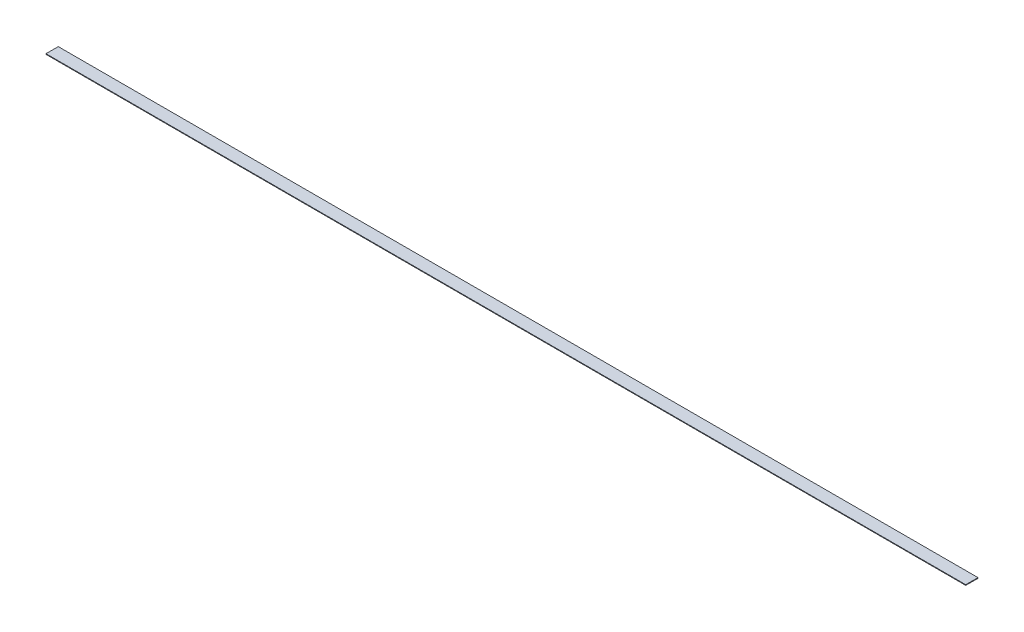
ISO-10303-21;
HEADER;
FILE_DESCRIPTION(('STEP AP214'),'2;1');
FILE_NAME('part.step','',(''),(''),'','','');
FILE_SCHEMA(('AUTOMOTIVE_DESIGN { 1 0 10303 214 1 1 1 1 }'));
ENDSEC;
DATA;
#1=APPLICATION_CONTEXT('core data for automotive mechanical design processes');
#2=APPLICATION_PROTOCOL_DEFINITION('international standard','automotive_design',2000,#1);
#3=PRODUCT_CONTEXT('',#1,'mechanical');
#4=PRODUCT('Part','Part','',(#3));
#5=PRODUCT_RELATED_PRODUCT_CATEGORY('part','',(#4));
#6=PRODUCT_DEFINITION_FORMATION('','',#4);
#7=PRODUCT_DEFINITION_CONTEXT('part definition',#1,'design');
#8=PRODUCT_DEFINITION('design','',#6,#7);
#9=PRODUCT_DEFINITION_SHAPE('','',#8);
#10=(LENGTH_UNIT() NAMED_UNIT(*) SI_UNIT(.MILLI.,.METRE.));
#11=(NAMED_UNIT(*) PLANE_ANGLE_UNIT() SI_UNIT($,.RADIAN.));
#12=(NAMED_UNIT(*) SI_UNIT($,.STERADIAN.) SOLID_ANGLE_UNIT());
#13=UNCERTAINTY_MEASURE_WITH_UNIT(LENGTH_MEASURE(1.E-05),#10,'distance_accuracy_value','');
#14=(GEOMETRIC_REPRESENTATION_CONTEXT(3) GLOBAL_UNCERTAINTY_ASSIGNED_CONTEXT((#13)) GLOBAL_UNIT_ASSIGNED_CONTEXT((#10,
#11,#12)) REPRESENTATION_CONTEXT('',''));
#15=CARTESIAN_POINT('',(0.,0.,0.));
#16=DIRECTION('',(0.,0.,1.));
#17=DIRECTION('',(1.,0.,0.));
#18=AXIS2_PLACEMENT_3D('',#15,#16,#17);
#19=CARTESIAN_POINT('',(1500.,2.,-20.0000000000002));
#20=DIRECTION('',(-1.,0.,0.));
#21=DIRECTION('',(0.,0.,1.));
#22=AXIS2_PLACEMENT_3D('',#19,#20,#21);
#23=PLANE('',#22);
#24=DIRECTION('',(0.,0.,-1.));
#25=VECTOR('',#24,1.);
#26=CARTESIAN_POINT('',(1500.,0.,-20.0000000000002));
#27=LINE('',#26,#25);
#28=CARTESIAN_POINT('',(1500.,0.,20.0000000000002));
#29=VERTEX_POINT('',#28);
#30=CARTESIAN_POINT('',(1500.,0.,-20.0000000000002));
#31=VERTEX_POINT('',#30);
#32=EDGE_CURVE('E112',#29,#31,#27,.T.);
#33=ORIENTED_EDGE('',*,*,#32,.T.);
#34=DIRECTION('',(0.,-1.,0.));
#35=VECTOR('',#34,1.);
#36=CARTESIAN_POINT('',(1500.,2.,-20.0000000000002));
#37=LINE('',#36,#35);
#38=CARTESIAN_POINT('',(1500.,2.,-20.0000000000002));
#39=VERTEX_POINT('',#38);
#40=EDGE_CURVE('E11',#39,#31,#37,.T.);
#41=ORIENTED_EDGE('',*,*,#40,.F.);
#42=DIRECTION('',(0.,0.,-1.));
#43=VECTOR('',#42,1.);
#44=CARTESIAN_POINT('',(1500.,2.,-20.0000000000002));
#45=LINE('',#44,#43);
#46=CARTESIAN_POINT('',(1500.,2.,20.0000000000002));
#47=VERTEX_POINT('',#46);
#48=EDGE_CURVE('E95',#47,#39,#45,.T.);
#49=ORIENTED_EDGE('',*,*,#48,.F.);
#50=DIRECTION('',(0.,-1.,0.));
#51=VECTOR('',#50,1.);
#52=CARTESIAN_POINT('',(1500.,2.,20.0000000000002));
#53=LINE('',#52,#51);
#54=EDGE_CURVE('E108',#47,#29,#53,.T.);
#55=ORIENTED_EDGE('',*,*,#54,.T.);
#56=EDGE_LOOP('',(#33,#41,#49,#55));
#57=FACE_BOUND('',#56,.T.);
#58=ADVANCED_FACE('F43',(#57),#23,.F.);
#59=CARTESIAN_POINT('',(-1500.,2.,-19.9999999999998));
#60=DIRECTION('',(0.,0.,1.));
#61=DIRECTION('',(1.,0.,0.));
#62=AXIS2_PLACEMENT_3D('',#59,#60,#61);
#63=PLANE('',#62);
#64=DIRECTION('',(-1.,0.,0.));
#65=VECTOR('',#64,1.);
#66=CARTESIAN_POINT('',(-1500.,0.,-19.9999999999998));
#67=LINE('',#66,#65);
#68=CARTESIAN_POINT('',(-1500.,0.,-19.9999999999998));
#69=VERTEX_POINT('',#68);
#70=EDGE_CURVE('E100',#31,#69,#67,.T.);
#71=ORIENTED_EDGE('',*,*,#70,.T.);
#72=DIRECTION('',(0.,-1.,0.));
#73=VECTOR('',#72,1.);
#74=CARTESIAN_POINT('',(-1500.,2.,-19.9999999999998));
#75=LINE('',#74,#73);
#76=CARTESIAN_POINT('',(-1500.,2.,-19.9999999999998));
#77=VERTEX_POINT('',#76);
#78=EDGE_CURVE('E52',#77,#69,#75,.T.);
#79=ORIENTED_EDGE('',*,*,#78,.F.);
#80=DIRECTION('',(-1.,0.,0.));
#81=VECTOR('',#80,1.);
#82=CARTESIAN_POINT('',(-1500.,2.,-19.9999999999998));
#83=LINE('',#82,#81);
#84=EDGE_CURVE('E90',#39,#77,#83,.T.);
#85=ORIENTED_EDGE('',*,*,#84,.F.);
#86=ORIENTED_EDGE('',*,*,#40,.T.);
#87=EDGE_LOOP('',(#71,#79,#85,#86));
#88=FACE_BOUND('',#87,.T.);
#89=ADVANCED_FACE('F99',(#88),#63,.F.);
#90=CARTESIAN_POINT('',(-1500.,2.,-19.9999999999998));
#91=DIRECTION('',(1.,0.,0.));
#92=DIRECTION('',(0.,0.,-1.));
#93=AXIS2_PLACEMENT_3D('',#90,#91,#92);
#94=PLANE('',#93);
#95=DIRECTION('',(0.,0.,1.));
#96=VECTOR('',#95,1.);
#97=CARTESIAN_POINT('',(-1500.,0.,-19.9999999999998));
#98=LINE('',#97,#96);
#99=CARTESIAN_POINT('',(-1500.,0.,20.0000000000002));
#100=VERTEX_POINT('',#99);
#101=EDGE_CURVE('E77',#69,#100,#98,.T.);
#102=ORIENTED_EDGE('',*,*,#101,.T.);
#103=DIRECTION('',(0.,-1.,0.));
#104=VECTOR('',#103,1.);
#105=CARTESIAN_POINT('',(-1500.,2.,20.0000000000002));
#106=LINE('',#105,#104);
#107=CARTESIAN_POINT('',(-1500.,2.,20.0000000000002));
#108=VERTEX_POINT('',#107);
#109=EDGE_CURVE('E102',#108,#100,#106,.T.);
#110=ORIENTED_EDGE('',*,*,#109,.F.);
#111=DIRECTION('',(0.,0.,1.));
#112=VECTOR('',#111,1.);
#113=CARTESIAN_POINT('',(-1500.,2.,-19.9999999999998));
#114=LINE('',#113,#112);
#115=EDGE_CURVE('E93',#77,#108,#114,.T.);
#116=ORIENTED_EDGE('',*,*,#115,.F.);
#117=ORIENTED_EDGE('',*,*,#78,.T.);
#118=EDGE_LOOP('',(#102,#110,#116,#117));
#119=FACE_BOUND('',#118,.T.);
#120=ADVANCED_FACE('F103',(#119),#94,.F.);
#121=CARTESIAN_POINT('',(-1500.,2.,20.0000000000002));
#122=DIRECTION('',(0.,0.,-1.));
#123=DIRECTION('',(-1.,0.,0.));
#124=AXIS2_PLACEMENT_3D('',#121,#122,#123);
#125=PLANE('',#124);
#126=DIRECTION('',(1.,0.,0.));
#127=VECTOR('',#126,1.);
#128=CARTESIAN_POINT('',(-1500.,0.,20.0000000000002));
#129=LINE('',#128,#127);
#130=EDGE_CURVE('E83',#100,#29,#129,.T.);
#131=ORIENTED_EDGE('',*,*,#130,.T.);
#132=ORIENTED_EDGE('',*,*,#54,.F.);
#133=DIRECTION('',(1.,0.,0.));
#134=VECTOR('',#133,1.);
#135=CARTESIAN_POINT('',(-1500.,2.,20.0000000000002));
#136=LINE('',#135,#134);
#137=EDGE_CURVE('E60',#108,#47,#136,.T.);
#138=ORIENTED_EDGE('',*,*,#137,.F.);
#139=ORIENTED_EDGE('',*,*,#109,.T.);
#140=EDGE_LOOP('',(#131,#132,#138,#139));
#141=FACE_BOUND('',#140,.T.);
#142=ADVANCED_FACE('F126',(#141),#125,.F.);
#143=CARTESIAN_POINT('',(0.,2.,0.));
#144=DIRECTION('',(0.,1.,0.));
#145=DIRECTION('',(0.,0.,1.));
#146=AXIS2_PLACEMENT_3D('',#143,#144,#145);
#147=PLANE('',#146);
#148=ORIENTED_EDGE('',*,*,#48,.T.);
#149=ORIENTED_EDGE('',*,*,#84,.T.);
#150=ORIENTED_EDGE('',*,*,#115,.T.);
#151=ORIENTED_EDGE('',*,*,#137,.T.);
#152=EDGE_LOOP('',(#148,#149,#150,#151));
#153=FACE_BOUND('',#152,.T.);
#154=ADVANCED_FACE('F91',(#153),#147,.T.);
#155=CARTESIAN_POINT('',(0.,0.,0.));
#156=DIRECTION('',(0.,1.,0.));
#157=DIRECTION('',(0.,0.,1.));
#158=AXIS2_PLACEMENT_3D('',#155,#156,#157);
#159=PLANE('',#158);
#160=ORIENTED_EDGE('',*,*,#32,.F.);
#161=ORIENTED_EDGE('',*,*,#130,.F.);
#162=ORIENTED_EDGE('',*,*,#101,.F.);
#163=ORIENTED_EDGE('',*,*,#70,.F.);
#164=EDGE_LOOP('',(#160,#161,#162,#163));
#165=FACE_BOUND('',#164,.T.);
#166=ADVANCED_FACE('F129',(#165),#159,.F.);
#167=CLOSED_SHELL('',(#58,#89,#120,#142,#154,#166));
#168=MANIFOLD_SOLID_BREP('B2',#167);
#169=ADVANCED_BREP_SHAPE_REPRESENTATION('',(#18,#168),#14);
#170=SHAPE_DEFINITION_REPRESENTATION(#9,#169);
ENDSEC;
END-ISO-10303-21;
